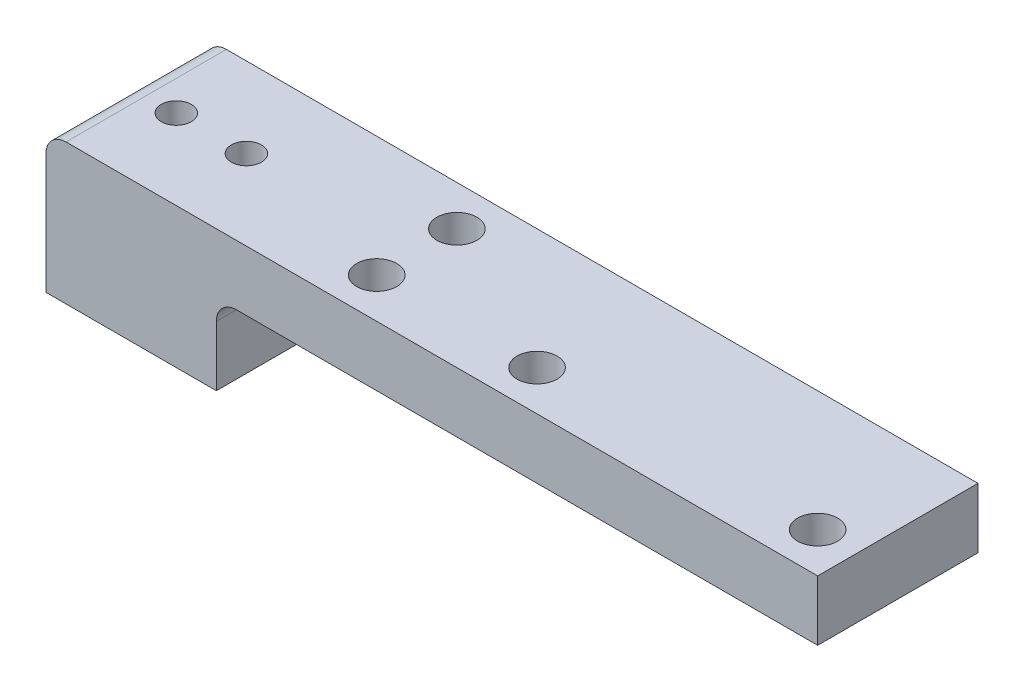
ISO-10303-21;
HEADER;
FILE_DESCRIPTION(('STEP AP214'),'2;1');
FILE_NAME('part.step','',(''),(''),'','','');
FILE_SCHEMA(('AUTOMOTIVE_DESIGN { 1 0 10303 214 1 1 1 1 }'));
ENDSEC;
DATA;
#1=APPLICATION_CONTEXT('core data for automotive mechanical design processes');
#2=APPLICATION_PROTOCOL_DEFINITION('international standard','automotive_design',2000,#1);
#3=PRODUCT_CONTEXT('',#1,'mechanical');
#4=PRODUCT('Part','Part','',(#3));
#5=PRODUCT_RELATED_PRODUCT_CATEGORY('part','',(#4));
#6=PRODUCT_DEFINITION_FORMATION('','',#4);
#7=PRODUCT_DEFINITION_CONTEXT('part definition',#1,'design');
#8=PRODUCT_DEFINITION('design','',#6,#7);
#9=PRODUCT_DEFINITION_SHAPE('','',#8);
#10=(LENGTH_UNIT() NAMED_UNIT(*) SI_UNIT(.MILLI.,.METRE.));
#11=(NAMED_UNIT(*) PLANE_ANGLE_UNIT() SI_UNIT($,.RADIAN.));
#12=(NAMED_UNIT(*) SI_UNIT($,.STERADIAN.) SOLID_ANGLE_UNIT());
#13=UNCERTAINTY_MEASURE_WITH_UNIT(LENGTH_MEASURE(1.E-05),#10,'distance_accuracy_value','');
#14=(GEOMETRIC_REPRESENTATION_CONTEXT(3) GLOBAL_UNCERTAINTY_ASSIGNED_CONTEXT((#13)) GLOBAL_UNIT_ASSIGNED_CONTEXT((#10,
#11,#12)) REPRESENTATION_CONTEXT('',''));
#15=CARTESIAN_POINT('',(0.,0.,0.));
#16=DIRECTION('',(0.,0.,1.));
#17=DIRECTION('',(1.,0.,0.));
#18=AXIS2_PLACEMENT_3D('',#15,#16,#17);
#19=CARTESIAN_POINT('',(8.5,14.,-8.));
#20=DIRECTION('',(-1.,0.,0.));
#21=DIRECTION('',(0.,0.,1.));
#22=AXIS2_PLACEMENT_3D('',#19,#20,#21);
#23=PLANE('',#22);
#24=DIRECTION('',(0.,-1.,0.));
#25=VECTOR('',#24,1.);
#26=CARTESIAN_POINT('',(8.5,14.,-8.));
#27=LINE('',#26,#25);
#28=CARTESIAN_POINT('',(8.5,6.,-8.));
#29=VERTEX_POINT('',#28);
#30=CARTESIAN_POINT('',(8.5,0.,-8.));
#31=VERTEX_POINT('',#30);
#32=EDGE_CURVE('E184',#29,#31,#27,.T.);
#33=ORIENTED_EDGE('',*,*,#32,.F.);
#34=DIRECTION('',(0.,0.,-1.));
#35=VECTOR('',#34,1.);
#36=CARTESIAN_POINT('',(8.5,6.,8.));
#37=LINE('',#36,#35);
#38=CARTESIAN_POINT('',(8.5,6.,8.));
#39=VERTEX_POINT('',#38);
#40=EDGE_CURVE('E206',#29,#39,#37,.F.);
#41=ORIENTED_EDGE('',*,*,#40,.T.);
#42=DIRECTION('',(0.,-1.,0.));
#43=VECTOR('',#42,1.);
#44=CARTESIAN_POINT('',(8.5,14.,8.));
#45=LINE('',#44,#43);
#46=CARTESIAN_POINT('',(8.5,0.,8.));
#47=VERTEX_POINT('',#46);
#48=EDGE_CURVE('E161',#39,#47,#45,.T.);
#49=ORIENTED_EDGE('',*,*,#48,.T.);
#50=DIRECTION('',(0.,0.,-1.));
#51=VECTOR('',#50,1.);
#52=CARTESIAN_POINT('',(8.5,0.,-8.));
#53=LINE('',#52,#51);
#54=EDGE_CURVE('E149',#47,#31,#53,.T.);
#55=ORIENTED_EDGE('',*,*,#54,.T.);
#56=EDGE_LOOP('',(#33,#41,#49,#55));
#57=FACE_BOUND('',#56,.T.);
#58=ADVANCED_FACE('F38',(#57),#23,.F.);
#59=CARTESIAN_POINT('',(0.,14.,0.));
#60=DIRECTION('',(0.,1.,0.));
#61=DIRECTION('',(0.,0.,1.));
#62=AXIS2_PLACEMENT_3D('',#59,#60,#61);
#63=PLANE('',#62);
#64=CARTESIAN_POINT('',(64.5,14.,4.));
#65=DIRECTION('',(0.,1.,0.));
#66=DIRECTION('',(0.,0.,1.));
#67=AXIS2_PLACEMENT_3D('',#64,#65,#66);
#68=CIRCLE('',#67,2.);
#69=CARTESIAN_POINT('',(64.5,14.,5.99999999999999));
#70=VERTEX_POINT('',#69);
#71=EDGE_CURVE('E248',#70,#70,#68,.T.);
#72=ORIENTED_EDGE('',*,*,#71,.F.);
#73=EDGE_LOOP('',(#72));
#74=FACE_BOUND('',#73,.T.);
#75=CARTESIAN_POINT('',(20.5,14.,-4.));
#76=DIRECTION('',(0.,1.,0.));
#77=DIRECTION('',(0.,0.,1.));
#78=AXIS2_PLACEMENT_3D('',#75,#76,#77);
#79=CIRCLE('',#78,2.);
#80=CARTESIAN_POINT('',(20.5,14.,-2.));
#81=VERTEX_POINT('',#80);
#82=EDGE_CURVE('E249',#81,#81,#79,.T.);
#83=ORIENTED_EDGE('',*,*,#82,.F.);
#84=EDGE_LOOP('',(#83));
#85=FACE_BOUND('',#84,.T.);
#86=CARTESIAN_POINT('',(20.5,14.,4.));
#87=DIRECTION('',(0.,1.,0.));
#88=DIRECTION('',(0.,0.,1.));
#89=AXIS2_PLACEMENT_3D('',#86,#87,#88);
#90=CIRCLE('',#89,2.00000000000001);
#91=CARTESIAN_POINT('',(20.5,14.,6.));
#92=VERTEX_POINT('',#91);
#93=EDGE_CURVE('E253',#92,#92,#90,.T.);
#94=ORIENTED_EDGE('',*,*,#93,.F.);
#95=EDGE_LOOP('',(#94));
#96=FACE_BOUND('',#95,.T.);
#97=CARTESIAN_POINT('',(36.5,14.,4.));
#98=DIRECTION('',(0.,1.,0.));
#99=DIRECTION('',(0.,0.,1.));
#100=AXIS2_PLACEMENT_3D('',#97,#98,#99);
#101=CIRCLE('',#100,2.);
#102=CARTESIAN_POINT('',(36.5,14.,6.));
#103=VERTEX_POINT('',#102);
#104=EDGE_CURVE('E193',#103,#103,#101,.T.);
#105=ORIENTED_EDGE('',*,*,#104,.F.);
#106=EDGE_LOOP('',(#105));
#107=FACE_BOUND('',#106,.T.);
#108=CARTESIAN_POINT('',(-3.5,14.,0.));
#109=DIRECTION('',(0.,1.,0.));
#110=DIRECTION('',(0.,0.,1.));
#111=AXIS2_PLACEMENT_3D('',#108,#109,#110);
#112=CIRCLE('',#111,1.5);
#113=CARTESIAN_POINT('',(-3.5,14.,1.5));
#114=VERTEX_POINT('',#113);
#115=EDGE_CURVE('E145',#114,#114,#112,.T.);
#116=ORIENTED_EDGE('',*,*,#115,.F.);
#117=EDGE_LOOP('',(#116));
#118=FACE_BOUND('',#117,.T.);
#119=DIRECTION('',(-1.,0.,0.));
#120=VECTOR('',#119,1.);
#121=CARTESIAN_POINT('',(-8.5,14.,-8.));
#122=LINE('',#121,#120);
#123=CARTESIAN_POINT('',(68.5,14.,-8.));
#124=VERTEX_POINT('',#123);
#125=CARTESIAN_POINT('',(-6.5,14.,-8.));
#126=VERTEX_POINT('',#125);
#127=EDGE_CURVE('E153',#124,#126,#122,.T.);
#128=ORIENTED_EDGE('',*,*,#127,.T.);
#129=DIRECTION('',(0.,0.,1.));
#130=VECTOR('',#129,1.);
#131=CARTESIAN_POINT('',(-6.5,14.,8.));
#132=LINE('',#131,#130);
#133=CARTESIAN_POINT('',(-6.5,14.,8.));
#134=VERTEX_POINT('',#133);
#135=EDGE_CURVE('E214',#126,#134,#132,.T.);
#136=ORIENTED_EDGE('',*,*,#135,.T.);
#137=DIRECTION('',(1.,0.,0.));
#138=VECTOR('',#137,1.);
#139=CARTESIAN_POINT('',(-8.5,14.,8.));
#140=LINE('',#139,#138);
#141=CARTESIAN_POINT('',(68.5,14.,8.));
#142=VERTEX_POINT('',#141);
#143=EDGE_CURVE('E157',#134,#142,#140,.T.);
#144=ORIENTED_EDGE('',*,*,#143,.T.);
#145=DIRECTION('',(0.,0.,1.));
#146=VECTOR('',#145,1.);
#147=CARTESIAN_POINT('',(68.5,14.,8.));
#148=LINE('',#147,#146);
#149=EDGE_CURVE('E122',#124,#142,#148,.T.);
#150=ORIENTED_EDGE('',*,*,#149,.F.);
#151=EDGE_LOOP('',(#128,#136,#144,#150));
#152=FACE_BOUND('',#151,.T.);
#153=CARTESIAN_POINT('',(3.5,14.,0.));
#154=DIRECTION('',(0.,1.,0.));
#155=DIRECTION('',(0.,0.,1.));
#156=AXIS2_PLACEMENT_3D('',#153,#154,#155);
#157=CIRCLE('',#156,1.5);
#158=CARTESIAN_POINT('',(3.5,14.,1.5));
#159=VERTEX_POINT('',#158);
#160=EDGE_CURVE('E136',#159,#159,#157,.T.);
#161=ORIENTED_EDGE('',*,*,#160,.F.);
#162=EDGE_LOOP('',(#161));
#163=FACE_BOUND('',#162,.T.);
#164=ADVANCED_FACE('F222',(#74,#85,#96,#107,#118,#152,#163),#63,.T.);
#165=CARTESIAN_POINT('',(0.,0.,0.));
#166=DIRECTION('',(0.,1.,0.));
#167=DIRECTION('',(0.,0.,1.));
#168=AXIS2_PLACEMENT_3D('',#165,#166,#167);
#169=PLANE('',#168);
#170=ORIENTED_EDGE('',*,*,#54,.F.);
#171=DIRECTION('',(1.,0.,0.));
#172=VECTOR('',#171,1.);
#173=CARTESIAN_POINT('',(-8.5,0.,8.));
#174=LINE('',#173,#172);
#175=CARTESIAN_POINT('',(-8.5,0.,8.));
#176=VERTEX_POINT('',#175);
#177=EDGE_CURVE('E158',#176,#47,#174,.T.);
#178=ORIENTED_EDGE('',*,*,#177,.F.);
#179=DIRECTION('',(0.,0.,1.));
#180=VECTOR('',#179,1.);
#181=CARTESIAN_POINT('',(-8.5,0.,-8.));
#182=LINE('',#181,#180);
#183=CARTESIAN_POINT('',(-8.5,0.,-8.));
#184=VERTEX_POINT('',#183);
#185=EDGE_CURVE('E169',#184,#176,#182,.T.);
#186=ORIENTED_EDGE('',*,*,#185,.F.);
#187=DIRECTION('',(-1.,0.,0.));
#188=VECTOR('',#187,1.);
#189=CARTESIAN_POINT('',(-8.5,0.,-8.));
#190=LINE('',#189,#188);
#191=EDGE_CURVE('E165',#31,#184,#190,.T.);
#192=ORIENTED_EDGE('',*,*,#191,.F.);
#193=EDGE_LOOP('',(#170,#178,#186,#192));
#194=FACE_BOUND('',#193,.T.);
#195=CARTESIAN_POINT('',(-3.5,0.,0.));
#196=DIRECTION('',(0.,1.,0.));
#197=DIRECTION('',(0.,0.,1.));
#198=AXIS2_PLACEMENT_3D('',#195,#196,#197);
#199=CIRCLE('',#198,1.5);
#200=CARTESIAN_POINT('',(-3.5,0.,1.5));
#201=VERTEX_POINT('',#200);
#202=EDGE_CURVE('E143',#201,#201,#199,.T.);
#203=ORIENTED_EDGE('',*,*,#202,.T.);
#204=EDGE_LOOP('',(#203));
#205=FACE_BOUND('',#204,.T.);
#206=CARTESIAN_POINT('',(3.5,0.,0.));
#207=DIRECTION('',(0.,1.,0.));
#208=DIRECTION('',(0.,0.,1.));
#209=AXIS2_PLACEMENT_3D('',#206,#207,#208);
#210=CIRCLE('',#209,1.5);
#211=CARTESIAN_POINT('',(3.5,0.,1.5));
#212=VERTEX_POINT('',#211);
#213=EDGE_CURVE('E131',#212,#212,#210,.T.);
#214=ORIENTED_EDGE('',*,*,#213,.T.);
#215=EDGE_LOOP('',(#214));
#216=FACE_BOUND('',#215,.T.);
#217=ADVANCED_FACE('F234',(#194,#205,#216),#169,.F.);
#218=CARTESIAN_POINT('',(-8.5,14.,-8.));
#219=DIRECTION('',(0.,0.,1.));
#220=DIRECTION('',(1.,0.,0.));
#221=AXIS2_PLACEMENT_3D('',#218,#219,#220);
#222=PLANE('',#221);
#223=DIRECTION('',(0.,-1.,0.));
#224=VECTOR('',#223,1.);
#225=CARTESIAN_POINT('',(-8.5,14.,-8.));
#226=LINE('',#225,#224);
#227=CARTESIAN_POINT('',(-8.5,12.,-8.));
#228=VERTEX_POINT('',#227);
#229=EDGE_CURVE('E181',#228,#184,#226,.T.);
#230=ORIENTED_EDGE('',*,*,#229,.F.);
#231=CARTESIAN_POINT('',(-6.5,12.,-8.));
#232=DIRECTION('',(0.,0.,1.));
#233=DIRECTION('',(1.,0.,0.));
#234=AXIS2_PLACEMENT_3D('',#231,#232,#233);
#235=CIRCLE('',#234,2.);
#236=EDGE_CURVE('E11',#228,#126,#235,.F.);
#237=ORIENTED_EDGE('',*,*,#236,.T.);
#238=ORIENTED_EDGE('',*,*,#127,.F.);
#239=DIRECTION('',(0.,1.,0.));
#240=VECTOR('',#239,1.);
#241=CARTESIAN_POINT('',(68.5,14.,-8.));
#242=LINE('',#241,#240);
#243=CARTESIAN_POINT('',(68.5,8.,-8.));
#244=VERTEX_POINT('',#243);
#245=EDGE_CURVE('E115',#244,#124,#242,.T.);
#246=ORIENTED_EDGE('',*,*,#245,.F.);
#247=DIRECTION('',(-1.,0.,0.));
#248=VECTOR('',#247,1.);
#249=CARTESIAN_POINT('',(68.5,8.,-8.));
#250=LINE('',#249,#248);
#251=CARTESIAN_POINT('',(10.5,8.,-8.));
#252=VERTEX_POINT('',#251);
#253=EDGE_CURVE('E110',#244,#252,#250,.T.);
#254=ORIENTED_EDGE('',*,*,#253,.T.);
#255=CARTESIAN_POINT('',(10.5,6.,-8.00000000000001));
#256=DIRECTION('',(0.,0.,1.));
#257=DIRECTION('',(1.,0.,0.));
#258=AXIS2_PLACEMENT_3D('',#255,#256,#257);
#259=CIRCLE('',#258,2.);
#260=EDGE_CURVE('E209',#252,#29,#259,.T.);
#261=ORIENTED_EDGE('',*,*,#260,.T.);
#262=ORIENTED_EDGE('',*,*,#32,.T.);
#263=ORIENTED_EDGE('',*,*,#191,.T.);
#264=EDGE_LOOP('',(#230,#237,#238,#246,#254,#261,#262,#263));
#265=FACE_BOUND('',#264,.T.);
#266=ADVANCED_FACE('F227',(#265),#222,.F.);
#267=CARTESIAN_POINT('',(-8.5,14.,-8.));
#268=DIRECTION('',(1.,0.,0.));
#269=DIRECTION('',(0.,0.,-1.));
#270=AXIS2_PLACEMENT_3D('',#267,#268,#269);
#271=PLANE('',#270);
#272=DIRECTION('',(0.,-1.,0.));
#273=VECTOR('',#272,1.);
#274=CARTESIAN_POINT('',(-8.5,14.,8.));
#275=LINE('',#274,#273);
#276=CARTESIAN_POINT('',(-8.5,12.,8.));
#277=VERTEX_POINT('',#276);
#278=EDGE_CURVE('E178',#277,#176,#275,.T.);
#279=ORIENTED_EDGE('',*,*,#278,.F.);
#280=DIRECTION('',(0.,0.,1.));
#281=VECTOR('',#280,1.);
#282=CARTESIAN_POINT('',(-8.5,12.,-8.));
#283=LINE('',#282,#281);
#284=EDGE_CURVE('E47',#277,#228,#283,.F.);
#285=ORIENTED_EDGE('',*,*,#284,.T.);
#286=ORIENTED_EDGE('',*,*,#229,.T.);
#287=ORIENTED_EDGE('',*,*,#185,.T.);
#288=EDGE_LOOP('',(#279,#285,#286,#287));
#289=FACE_BOUND('',#288,.T.);
#290=ADVANCED_FACE('F230',(#289),#271,.F.);
#291=CARTESIAN_POINT('',(-8.5,14.,8.));
#292=DIRECTION('',(0.,0.,-1.));
#293=DIRECTION('',(-1.,0.,0.));
#294=AXIS2_PLACEMENT_3D('',#291,#292,#293);
#295=PLANE('',#294);
#296=ORIENTED_EDGE('',*,*,#143,.F.);
#297=CARTESIAN_POINT('',(-6.5,12.,8.));
#298=DIRECTION('',(0.,0.,-1.));
#299=DIRECTION('',(-1.,0.,0.));
#300=AXIS2_PLACEMENT_3D('',#297,#298,#299);
#301=CIRCLE('',#300,2.);
#302=EDGE_CURVE('E61',#134,#277,#301,.F.);
#303=ORIENTED_EDGE('',*,*,#302,.T.);
#304=ORIENTED_EDGE('',*,*,#278,.T.);
#305=ORIENTED_EDGE('',*,*,#177,.T.);
#306=ORIENTED_EDGE('',*,*,#48,.F.);
#307=CARTESIAN_POINT('',(10.5,6.,8.));
#308=DIRECTION('',(0.,0.,-1.));
#309=DIRECTION('',(-1.,0.,0.));
#310=AXIS2_PLACEMENT_3D('',#307,#308,#309);
#311=CIRCLE('',#310,2.);
#312=CARTESIAN_POINT('',(10.5,8.,8.));
#313=VERTEX_POINT('',#312);
#314=EDGE_CURVE('E129',#39,#313,#311,.T.);
#315=ORIENTED_EDGE('',*,*,#314,.T.);
#316=DIRECTION('',(-1.,0.,0.));
#317=VECTOR('',#316,1.);
#318=CARTESIAN_POINT('',(68.5,8.,8.));
#319=LINE('',#318,#317);
#320=CARTESIAN_POINT('',(68.5,8.,8.));
#321=VERTEX_POINT('',#320);
#322=EDGE_CURVE('E107',#321,#313,#319,.T.);
#323=ORIENTED_EDGE('',*,*,#322,.F.);
#324=DIRECTION('',(0.,-1.,0.));
#325=VECTOR('',#324,1.);
#326=CARTESIAN_POINT('',(68.5,14.,8.));
#327=LINE('',#326,#325);
#328=EDGE_CURVE('E116',#142,#321,#327,.T.);
#329=ORIENTED_EDGE('',*,*,#328,.F.);
#330=EDGE_LOOP('',(#296,#303,#304,#305,#306,#315,#323,#329));
#331=FACE_BOUND('',#330,.T.);
#332=ADVANCED_FACE('F126',(#331),#295,.F.);
#333=CARTESIAN_POINT('',(-3.5,14.,0.));
#334=DIRECTION('',(0.,-1.,0.));
#335=DIRECTION('',(0.,0.,-1.));
#336=AXIS2_PLACEMENT_3D('',#333,#334,#335);
#337=CYLINDRICAL_SURFACE('',#336,1.5);
#338=ORIENTED_EDGE('',*,*,#115,.T.);
#339=EDGE_LOOP('',(#338));
#340=FACE_BOUND('',#339,.T.);
#341=ORIENTED_EDGE('',*,*,#202,.F.);
#342=EDGE_LOOP('',(#341));
#343=FACE_BOUND('',#342,.T.);
#344=ADVANCED_FACE('F272',(#340,#343),#337,.F.);
#345=CARTESIAN_POINT('',(3.5,14.,0.));
#346=DIRECTION('',(0.,-1.,0.));
#347=DIRECTION('',(0.,0.,-1.));
#348=AXIS2_PLACEMENT_3D('',#345,#346,#347);
#349=CYLINDRICAL_SURFACE('',#348,1.5);
#350=ORIENTED_EDGE('',*,*,#160,.T.);
#351=EDGE_LOOP('',(#350));
#352=FACE_BOUND('',#351,.T.);
#353=ORIENTED_EDGE('',*,*,#213,.F.);
#354=EDGE_LOOP('',(#353));
#355=FACE_BOUND('',#354,.T.);
#356=ADVANCED_FACE('F275',(#352,#355),#349,.F.);
#357=CARTESIAN_POINT('',(68.5,8.,8.));
#358=DIRECTION('',(0.,1.,0.));
#359=DIRECTION('',(0.,0.,1.));
#360=AXIS2_PLACEMENT_3D('',#357,#358,#359);
#361=PLANE('',#360);
#362=CARTESIAN_POINT('',(64.5,8.,4.));
#363=DIRECTION('',(0.,1.,0.));
#364=DIRECTION('',(0.,0.,1.));
#365=AXIS2_PLACEMENT_3D('',#362,#363,#364);
#366=CIRCLE('',#365,2.);
#367=CARTESIAN_POINT('',(64.5,8.,5.99999999999999));
#368=VERTEX_POINT('',#367);
#369=EDGE_CURVE('E124',#368,#368,#366,.T.);
#370=ORIENTED_EDGE('',*,*,#369,.T.);
#371=EDGE_LOOP('',(#370));
#372=FACE_BOUND('',#371,.T.);
#373=CARTESIAN_POINT('',(20.5,8.,-4.));
#374=DIRECTION('',(0.,1.,0.));
#375=DIRECTION('',(0.,0.,1.));
#376=AXIS2_PLACEMENT_3D('',#373,#374,#375);
#377=CIRCLE('',#376,2.);
#378=CARTESIAN_POINT('',(20.5,8.,-2.));
#379=VERTEX_POINT('',#378);
#380=EDGE_CURVE('E197',#379,#379,#377,.T.);
#381=ORIENTED_EDGE('',*,*,#380,.T.);
#382=EDGE_LOOP('',(#381));
#383=FACE_BOUND('',#382,.T.);
#384=CARTESIAN_POINT('',(20.5,8.,4.));
#385=DIRECTION('',(0.,1.,0.));
#386=DIRECTION('',(0.,0.,1.));
#387=AXIS2_PLACEMENT_3D('',#384,#385,#386);
#388=CIRCLE('',#387,2.00000000000001);
#389=CARTESIAN_POINT('',(20.5,8.,6.));
#390=VERTEX_POINT('',#389);
#391=EDGE_CURVE('E192',#390,#390,#388,.T.);
#392=ORIENTED_EDGE('',*,*,#391,.T.);
#393=EDGE_LOOP('',(#392));
#394=FACE_BOUND('',#393,.T.);
#395=CARTESIAN_POINT('',(36.5,8.,4.));
#396=DIRECTION('',(0.,1.,0.));
#397=DIRECTION('',(0.,0.,1.));
#398=AXIS2_PLACEMENT_3D('',#395,#396,#397);
#399=CIRCLE('',#398,2.);
#400=CARTESIAN_POINT('',(36.5,8.,6.));
#401=VERTEX_POINT('',#400);
#402=EDGE_CURVE('E188',#401,#401,#399,.T.);
#403=ORIENTED_EDGE('',*,*,#402,.T.);
#404=EDGE_LOOP('',(#403));
#405=FACE_BOUND('',#404,.T.);
#406=ORIENTED_EDGE('',*,*,#322,.T.);
#407=DIRECTION('',(0.,0.,-1.));
#408=VECTOR('',#407,1.);
#409=CARTESIAN_POINT('',(10.5,8.,-8.));
#410=LINE('',#409,#408);
#411=EDGE_CURVE('E187',#313,#252,#410,.T.);
#412=ORIENTED_EDGE('',*,*,#411,.T.);
#413=ORIENTED_EDGE('',*,*,#253,.F.);
#414=DIRECTION('',(0.,0.,-1.));
#415=VECTOR('',#414,1.);
#416=CARTESIAN_POINT('',(68.5,8.,8.));
#417=LINE('',#416,#415);
#418=EDGE_CURVE('E102',#321,#244,#417,.T.);
#419=ORIENTED_EDGE('',*,*,#418,.F.);
#420=EDGE_LOOP('',(#406,#412,#413,#419));
#421=FACE_BOUND('',#420,.T.);
#422=ADVANCED_FACE('F104',(#372,#383,#394,#405,#421),#361,.F.);
#423=CARTESIAN_POINT('',(68.5,0.,0.));
#424=DIRECTION('',(1.,0.,0.));
#425=DIRECTION('',(0.,0.,-1.));
#426=AXIS2_PLACEMENT_3D('',#423,#424,#425);
#427=PLANE('',#426);
#428=ORIENTED_EDGE('',*,*,#328,.T.);
#429=ORIENTED_EDGE('',*,*,#418,.T.);
#430=ORIENTED_EDGE('',*,*,#245,.T.);
#431=ORIENTED_EDGE('',*,*,#149,.T.);
#432=EDGE_LOOP('',(#428,#429,#430,#431));
#433=FACE_BOUND('',#432,.T.);
#434=ADVANCED_FACE('F120',(#433),#427,.T.);
#435=CARTESIAN_POINT('',(36.5,0.,4.));
#436=DIRECTION('',(0.,1.,0.));
#437=DIRECTION('',(0.,0.,1.));
#438=AXIS2_PLACEMENT_3D('',#435,#436,#437);
#439=CYLINDRICAL_SURFACE('',#438,2.);
#440=ORIENTED_EDGE('',*,*,#104,.T.);
#441=EDGE_LOOP('',(#440));
#442=FACE_BOUND('',#441,.T.);
#443=ORIENTED_EDGE('',*,*,#402,.F.);
#444=EDGE_LOOP('',(#443));
#445=FACE_BOUND('',#444,.T.);
#446=ADVANCED_FACE('F315',(#442,#445),#439,.F.);
#447=CARTESIAN_POINT('',(20.5,0.,4.));
#448=DIRECTION('',(0.,1.,0.));
#449=DIRECTION('',(0.,0.,1.));
#450=AXIS2_PLACEMENT_3D('',#447,#448,#449);
#451=CYLINDRICAL_SURFACE('',#450,2.00000000000001);
#452=ORIENTED_EDGE('',*,*,#93,.T.);
#453=EDGE_LOOP('',(#452));
#454=FACE_BOUND('',#453,.T.);
#455=ORIENTED_EDGE('',*,*,#391,.F.);
#456=EDGE_LOOP('',(#455));
#457=FACE_BOUND('',#456,.T.);
#458=ADVANCED_FACE('F261',(#454,#457),#451,.F.);
#459=CARTESIAN_POINT('',(20.5,0.,-4.));
#460=DIRECTION('',(0.,1.,0.));
#461=DIRECTION('',(0.,0.,1.));
#462=AXIS2_PLACEMENT_3D('',#459,#460,#461);
#463=CYLINDRICAL_SURFACE('',#462,2.);
#464=ORIENTED_EDGE('',*,*,#82,.T.);
#465=EDGE_LOOP('',(#464));
#466=FACE_BOUND('',#465,.T.);
#467=ORIENTED_EDGE('',*,*,#380,.F.);
#468=EDGE_LOOP('',(#467));
#469=FACE_BOUND('',#468,.T.);
#470=ADVANCED_FACE('F305',(#466,#469),#463,.F.);
#471=CARTESIAN_POINT('',(64.5,0.,4.));
#472=DIRECTION('',(0.,1.,0.));
#473=DIRECTION('',(0.,0.,1.));
#474=AXIS2_PLACEMENT_3D('',#471,#472,#473);
#475=CYLINDRICAL_SURFACE('',#474,2.);
#476=ORIENTED_EDGE('',*,*,#71,.T.);
#477=EDGE_LOOP('',(#476));
#478=FACE_BOUND('',#477,.T.);
#479=ORIENTED_EDGE('',*,*,#369,.F.);
#480=EDGE_LOOP('',(#479));
#481=FACE_BOUND('',#480,.T.);
#482=ADVANCED_FACE('F300',(#478,#481),#475,.F.);
#483=CARTESIAN_POINT('',(10.5,6.,8.));
#484=DIRECTION('',(0.,0.,1.));
#485=DIRECTION('',(1.,0.,0.));
#486=AXIS2_PLACEMENT_3D('',#483,#484,#485);
#487=CYLINDRICAL_SURFACE('',#486,2.);
#488=ORIENTED_EDGE('',*,*,#314,.F.);
#489=ORIENTED_EDGE('',*,*,#40,.F.);
#490=ORIENTED_EDGE('',*,*,#260,.F.);
#491=ORIENTED_EDGE('',*,*,#411,.F.);
#492=EDGE_LOOP('',(#488,#489,#490,#491));
#493=FACE_BOUND('',#492,.T.);
#494=ADVANCED_FACE('F239',(#493),#487,.F.);
#495=CARTESIAN_POINT('',(-6.5,12.,0.));
#496=DIRECTION('',(0.,0.,-1.));
#497=DIRECTION('',(-1.,0.,0.));
#498=AXIS2_PLACEMENT_3D('',#495,#496,#497);
#499=CYLINDRICAL_SURFACE('',#498,2.);
#500=ORIENTED_EDGE('',*,*,#236,.F.);
#501=ORIENTED_EDGE('',*,*,#284,.F.);
#502=ORIENTED_EDGE('',*,*,#302,.F.);
#503=ORIENTED_EDGE('',*,*,#135,.F.);
#504=EDGE_LOOP('',(#500,#501,#502,#503));
#505=FACE_BOUND('',#504,.T.);
#506=ADVANCED_FACE('F40',(#505),#499,.T.);
#507=CLOSED_SHELL('',(#58,#164,#217,#266,#290,#332,#344,#356,#422,#434,#446,#458,#470,#482,#494,#506));
#508=MANIFOLD_SOLID_BREP('B2',#507);
#509=ADVANCED_BREP_SHAPE_REPRESENTATION('',(#18,#508),#14);
#510=SHAPE_DEFINITION_REPRESENTATION(#9,#509);
ENDSEC;
END-ISO-10303-21;
